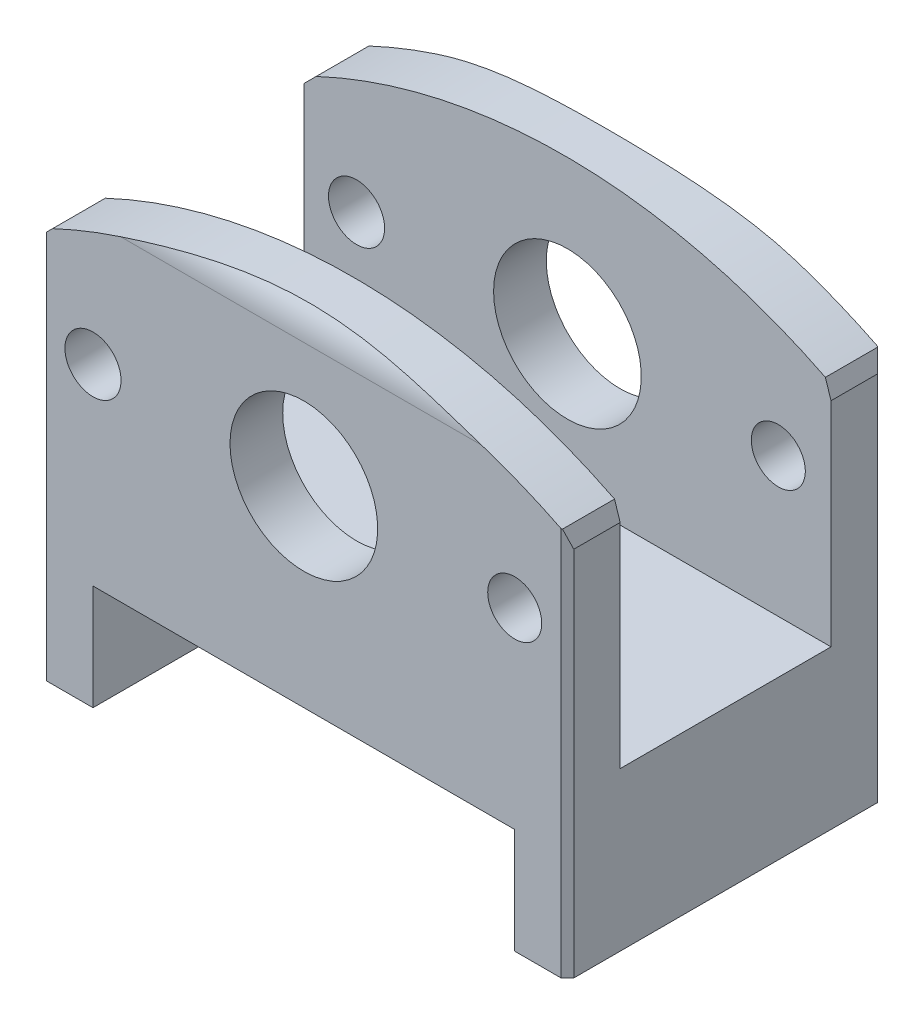
ISO-10303-21;
HEADER;
FILE_DESCRIPTION(('STEP AP214'),'2;1');
FILE_NAME('part.step','',(''),(''),'','','');
FILE_SCHEMA(('AUTOMOTIVE_DESIGN { 1 0 10303 214 1 1 1 1 }'));
ENDSEC;
DATA;
#1=APPLICATION_CONTEXT('core data for automotive mechanical design processes');
#2=APPLICATION_PROTOCOL_DEFINITION('international standard','automotive_design',2000,#1);
#3=PRODUCT_CONTEXT('',#1,'mechanical');
#4=PRODUCT('Part','Part','',(#3));
#5=PRODUCT_RELATED_PRODUCT_CATEGORY('part','',(#4));
#6=PRODUCT_DEFINITION_FORMATION('','',#4);
#7=PRODUCT_DEFINITION_CONTEXT('part definition',#1,'design');
#8=PRODUCT_DEFINITION('design','',#6,#7);
#9=PRODUCT_DEFINITION_SHAPE('','',#8);
#10=(LENGTH_UNIT() NAMED_UNIT(*) SI_UNIT(.MILLI.,.METRE.));
#11=(NAMED_UNIT(*) PLANE_ANGLE_UNIT() SI_UNIT($,.RADIAN.));
#12=(NAMED_UNIT(*) SI_UNIT($,.STERADIAN.) SOLID_ANGLE_UNIT());
#13=UNCERTAINTY_MEASURE_WITH_UNIT(LENGTH_MEASURE(1.E-05),#10,'distance_accuracy_value','');
#14=(GEOMETRIC_REPRESENTATION_CONTEXT(3) GLOBAL_UNCERTAINTY_ASSIGNED_CONTEXT((#13)) GLOBAL_UNIT_ASSIGNED_CONTEXT((#10,
#11,#12)) REPRESENTATION_CONTEXT('',''));
#15=CARTESIAN_POINT('',(0.,0.,0.));
#16=DIRECTION('',(0.,0.,1.));
#17=DIRECTION('',(1.,0.,0.));
#18=AXIS2_PLACEMENT_3D('',#15,#16,#17);
#19=CARTESIAN_POINT('',(0.,0.,38.1));
#20=DIRECTION('',(0.,1.,0.));
#21=DIRECTION('',(0.,0.,1.));
#22=AXIS2_PLACEMENT_3D('',#19,#20,#21);
#23=PLANE('',#22);
#24=DIRECTION('',(1.,0.,0.));
#25=VECTOR('',#24,1.);
#26=CARTESIAN_POINT('',(0.,0.,38.1));
#27=LINE('',#26,#25);
#28=CARTESIAN_POINT('',(0.761999999999999,0.,38.1));
#29=VERTEX_POINT('',#28);
#30=CARTESIAN_POINT('',(6.35,0.,38.1));
#31=VERTEX_POINT('',#30);
#32=EDGE_CURVE('E265',#29,#31,#27,.T.);
#33=ORIENTED_EDGE('',*,*,#32,.F.);
#34=DIRECTION('',(0.707106781186548,0.,0.707106781186548));
#35=VECTOR('',#34,1.);
#36=CARTESIAN_POINT('',(0.,0.,37.338));
#37=LINE('',#36,#35);
#38=CARTESIAN_POINT('',(0.,0.,37.338));
#39=VERTEX_POINT('',#38);
#40=EDGE_CURVE('E335',#29,#39,#37,.F.);
#41=ORIENTED_EDGE('',*,*,#40,.T.);
#42=DIRECTION('',(0.,0.,-1.));
#43=VECTOR('',#42,1.);
#44=CARTESIAN_POINT('',(0.,0.,38.1));
#45=LINE('',#44,#43);
#46=CARTESIAN_POINT('',(0.,0.,0.762000000000013));
#47=VERTEX_POINT('',#46);
#48=EDGE_CURVE('E268',#39,#47,#45,.T.);
#49=ORIENTED_EDGE('',*,*,#48,.T.);
#50=DIRECTION('',(0.707106781186541,0.,-0.707106781186554));
#51=VECTOR('',#50,1.);
#52=CARTESIAN_POINT('',(0.761999999999999,0.,0.));
#53=LINE('',#52,#51);
#54=CARTESIAN_POINT('',(0.761999999999999,0.,0.));
#55=VERTEX_POINT('',#54);
#56=EDGE_CURVE('E332',#47,#55,#53,.T.);
#57=ORIENTED_EDGE('',*,*,#56,.T.);
#58=DIRECTION('',(1.,0.,0.));
#59=VECTOR('',#58,1.);
#60=CARTESIAN_POINT('',(0.,0.,0.));
#61=LINE('',#60,#59);
#62=CARTESIAN_POINT('',(6.35,0.,0.));
#63=VERTEX_POINT('',#62);
#64=EDGE_CURVE('E270',#55,#63,#61,.T.);
#65=ORIENTED_EDGE('',*,*,#64,.T.);
#66=DIRECTION('',(0.,0.,-1.));
#67=VECTOR('',#66,1.);
#68=CARTESIAN_POINT('',(6.35,0.,38.1));
#69=LINE('',#68,#67);
#70=EDGE_CURVE('E239',#31,#63,#69,.T.);
#71=ORIENTED_EDGE('',*,*,#70,.F.);
#72=EDGE_LOOP('',(#33,#41,#49,#57,#65,#71));
#73=FACE_BOUND('',#72,.T.);
#74=ADVANCED_FACE('F40',(#73),#23,.F.);
#75=DIRECTION('',(0.,0.,-1.));
#76=VECTOR('',#75,1.);
#77=CARTESIAN_POINT('',(63.5,0.,38.1));
#78=LINE('',#77,#76);
#79=CARTESIAN_POINT('',(63.5,0.,37.338));
#80=VERTEX_POINT('',#79);
#81=CARTESIAN_POINT('',(63.5,0.,0.761999999999999));
#82=VERTEX_POINT('',#81);
#83=EDGE_CURVE('E276',#80,#82,#78,.T.);
#84=ORIENTED_EDGE('',*,*,#83,.F.);
#85=DIRECTION('',(-0.707106781186548,0.,0.707106781186548));
#86=VECTOR('',#85,1.);
#87=CARTESIAN_POINT('',(62.738,0.,38.1));
#88=LINE('',#87,#86);
#89=CARTESIAN_POINT('',(62.738,0.,38.1));
#90=VERTEX_POINT('',#89);
#91=EDGE_CURVE('E322',#80,#90,#88,.T.);
#92=ORIENTED_EDGE('',*,*,#91,.T.);
#93=CARTESIAN_POINT('',(57.15,0.,38.1));
#94=VERTEX_POINT('',#93);
#95=EDGE_CURVE('E269',#94,#90,#27,.T.);
#96=ORIENTED_EDGE('',*,*,#95,.F.);
#97=DIRECTION('',(0.,0.,-1.));
#98=VECTOR('',#97,1.);
#99=CARTESIAN_POINT('',(57.15,0.,38.1));
#100=LINE('',#99,#98);
#101=CARTESIAN_POINT('',(57.15,0.,0.));
#102=VERTEX_POINT('',#101);
#103=EDGE_CURVE('E251',#94,#102,#100,.T.);
#104=ORIENTED_EDGE('',*,*,#103,.T.);
#105=CARTESIAN_POINT('',(62.738,0.,0.));
#106=VERTEX_POINT('',#105);
#107=EDGE_CURVE('E255',#102,#106,#61,.T.);
#108=ORIENTED_EDGE('',*,*,#107,.T.);
#109=DIRECTION('',(-0.707106781186554,0.,-0.707106781186541));
#110=VECTOR('',#109,1.);
#111=CARTESIAN_POINT('',(63.5,0.,0.761999999999999));
#112=LINE('',#111,#110);
#113=EDGE_CURVE('E308',#106,#82,#112,.F.);
#114=ORIENTED_EDGE('',*,*,#113,.T.);
#115=EDGE_LOOP('',(#84,#92,#96,#104,#108,#114));
#116=FACE_BOUND('',#115,.T.);
#117=ADVANCED_FACE('F518',(#116),#23,.F.);
#118=CARTESIAN_POINT('',(63.5,0.,38.1));
#119=DIRECTION('',(-1.,0.,0.));
#120=DIRECTION('',(0.,0.,1.));
#121=AXIS2_PLACEMENT_3D('',#118,#119,#120);
#122=PLANE('',#121);
#123=DIRECTION('',(0.,1.,0.));
#124=VECTOR('',#123,1.);
#125=CARTESIAN_POINT('',(63.5,0.,0.761999999999999));
#126=LINE('',#125,#124);
#127=CARTESIAN_POINT('',(63.5,44.725116352659,0.761999999999999));
#128=VERTEX_POINT('',#127);
#129=EDGE_CURVE('E287',#82,#128,#126,.T.);
#130=ORIENTED_EDGE('',*,*,#129,.T.);
#131=DIRECTION('',(0.,0.,1.));
#132=VECTOR('',#131,1.);
#133=CARTESIAN_POINT('',(63.5,44.725116352659,38.1));
#134=LINE('',#133,#132);
#135=CARTESIAN_POINT('',(63.5,44.725116352659,6.35000000000001));
#136=VERTEX_POINT('',#135);
#137=EDGE_CURVE('E217',#128,#136,#134,.T.);
#138=ORIENTED_EDGE('',*,*,#137,.T.);
#139=DIRECTION('',(0.,1.,0.));
#140=VECTOR('',#139,1.);
#141=CARTESIAN_POINT('',(63.5,19.0499999999999,6.35000000000001));
#142=LINE('',#141,#140);
#143=CARTESIAN_POINT('',(63.5,19.0499999999999,6.35000000000001));
#144=VERTEX_POINT('',#143);
#145=EDGE_CURVE('E195',#144,#136,#142,.T.);
#146=ORIENTED_EDGE('',*,*,#145,.F.);
#147=DIRECTION('',(0.,0.,-1.));
#148=VECTOR('',#147,1.);
#149=CARTESIAN_POINT('',(63.5,19.0499999999999,31.75));
#150=LINE('',#149,#148);
#151=CARTESIAN_POINT('',(63.5,19.0499999999999,31.75));
#152=VERTEX_POINT('',#151);
#153=EDGE_CURVE('E202',#152,#144,#150,.T.);
#154=ORIENTED_EDGE('',*,*,#153,.F.);
#155=DIRECTION('',(0.,1.,0.));
#156=VECTOR('',#155,1.);
#157=CARTESIAN_POINT('',(63.5,19.0499999999999,31.75));
#158=LINE('',#157,#156);
#159=CARTESIAN_POINT('',(63.5,44.725116352659,31.75));
#160=VERTEX_POINT('',#159);
#161=EDGE_CURVE('E245',#152,#160,#158,.T.);
#162=ORIENTED_EDGE('',*,*,#161,.T.);
#163=DIRECTION('',(0.,0.,1.));
#164=VECTOR('',#163,1.);
#165=CARTESIAN_POINT('',(63.5,44.725116352659,38.1));
#166=LINE('',#165,#164);
#167=CARTESIAN_POINT('',(63.5,44.725116352659,37.338));
#168=VERTEX_POINT('',#167);
#169=EDGE_CURVE('E386',#160,#168,#166,.T.);
#170=ORIENTED_EDGE('',*,*,#169,.T.);
#171=DIRECTION('',(0.,-1.,0.));
#172=VECTOR('',#171,1.);
#173=CARTESIAN_POINT('',(63.5,0.,37.338));
#174=LINE('',#173,#172);
#175=EDGE_CURVE('E312',#168,#80,#174,.T.);
#176=ORIENTED_EDGE('',*,*,#175,.T.);
#177=ORIENTED_EDGE('',*,*,#83,.T.);
#178=EDGE_LOOP('',(#130,#138,#146,#154,#162,#170,#176,#177));
#179=FACE_BOUND('',#178,.T.);
#180=ADVANCED_FACE('F215',(#179),#122,.F.);
#181=CARTESIAN_POINT('',(0.,0.,38.1));
#182=DIRECTION('',(-1.,0.,0.));
#183=DIRECTION('',(0.,-1.,0.));
#184=AXIS2_PLACEMENT_3D('',#181,#182,#183);
#185=PLANE('',#184);
#186=DIRECTION('',(0.,1.,0.));
#187=VECTOR('',#186,1.);
#188=CARTESIAN_POINT('',(0.,19.0499999999999,6.35000000000002));
#189=LINE('',#188,#187);
#190=CARTESIAN_POINT('',(0.,19.0499999999999,6.35000000000001));
#191=VERTEX_POINT('',#190);
#192=CARTESIAN_POINT('',(0.,46.0638251112993,6.35000000000002));
#193=VERTEX_POINT('',#192);
#194=EDGE_CURVE('E197',#191,#193,#189,.T.);
#195=ORIENTED_EDGE('',*,*,#194,.T.);
#196=DIRECTION('',(0.,0.,-1.));
#197=VECTOR('',#196,1.);
#198=CARTESIAN_POINT('',(0.,46.0638251112993,0.762000000000013));
#199=LINE('',#198,#197);
#200=CARTESIAN_POINT('',(0.,46.0638251112993,0.762000000000013));
#201=VERTEX_POINT('',#200);
#202=EDGE_CURVE('E358',#193,#201,#199,.T.);
#203=ORIENTED_EDGE('',*,*,#202,.T.);
#204=DIRECTION('',(0.,-1.,0.));
#205=VECTOR('',#204,1.);
#206=CARTESIAN_POINT('',(0.,0.,0.762000000000013));
#207=LINE('',#206,#205);
#208=EDGE_CURVE('E325',#201,#47,#207,.T.);
#209=ORIENTED_EDGE('',*,*,#208,.T.);
#210=ORIENTED_EDGE('',*,*,#48,.F.);
#211=DIRECTION('',(0.,1.,0.));
#212=VECTOR('',#211,1.);
#213=CARTESIAN_POINT('',(0.,0.,37.338));
#214=LINE('',#213,#212);
#215=CARTESIAN_POINT('',(0.,46.0638251112993,37.338));
#216=VERTEX_POINT('',#215);
#217=EDGE_CURVE('E328',#39,#216,#214,.T.);
#218=ORIENTED_EDGE('',*,*,#217,.T.);
#219=DIRECTION('',(0.,0.,-1.));
#220=VECTOR('',#219,1.);
#221=CARTESIAN_POINT('',(0.,46.0638251112993,31.75));
#222=LINE('',#221,#220);
#223=CARTESIAN_POINT('',(0.,46.0638251112993,31.75));
#224=VERTEX_POINT('',#223);
#225=EDGE_CURVE('E355',#216,#224,#222,.T.);
#226=ORIENTED_EDGE('',*,*,#225,.T.);
#227=DIRECTION('',(0.,1.,0.));
#228=VECTOR('',#227,1.);
#229=CARTESIAN_POINT('',(0.,19.0499999999999,31.75));
#230=LINE('',#229,#228);
#231=CARTESIAN_POINT('',(0.,19.0499999999999,31.75));
#232=VERTEX_POINT('',#231);
#233=EDGE_CURVE('E222',#232,#224,#230,.T.);
#234=ORIENTED_EDGE('',*,*,#233,.F.);
#235=DIRECTION('',(0.,0.,1.));
#236=VECTOR('',#235,1.);
#237=CARTESIAN_POINT('',(0.,19.0499999999999,31.75));
#238=LINE('',#237,#236);
#239=EDGE_CURVE('E201',#191,#232,#238,.T.);
#240=ORIENTED_EDGE('',*,*,#239,.F.);
#241=EDGE_LOOP('',(#195,#203,#209,#210,#218,#226,#234,#240));
#242=FACE_BOUND('',#241,.T.);
#243=ADVANCED_FACE('F528',(#242),#185,.T.);
#244=CARTESIAN_POINT('',(0.,0.,38.1));
#245=DIRECTION('',(0.,0.,1.));
#246=DIRECTION('',(1.,0.,0.));
#247=AXIS2_PLACEMENT_3D('',#244,#245,#246);
#248=PLANE('',#247);
#249=CARTESIAN_POINT('',(31.4169464471682,-15.9327542649305,38.1));
#250=DIRECTION('',(0.,0.,1.));
#251=DIRECTION('',(1.,0.,0.));
#252=AXIS2_PLACEMENT_3D('',#249,#250,#251);
#253=CIRCLE('',#252,70.1830735247949);
#254=CARTESIAN_POINT('',(1.48248817745936,47.5463132887586,38.1));
#255=VERTEX_POINT('',#254);
#256=CARTESIAN_POINT('',(9.68210534806725,50.8,38.1));
#257=VERTEX_POINT('',#256);
#258=EDGE_CURVE('E456',#255,#257,#253,.F.);
#259=ORIENTED_EDGE('',*,*,#258,.F.);
#260=DIRECTION('',(0.70710678118655,0.707106781186545,0.));
#261=VECTOR('',#260,1.);
#262=CARTESIAN_POINT('',(-23.0319125556496,23.0319125556498,38.1));
#263=LINE('',#262,#261);
#264=CARTESIAN_POINT('',(0.76199999999999,46.8258251112993,38.1));
#265=VERTEX_POINT('',#264);
#266=EDGE_CURVE('E374',#255,#265,#263,.F.);
#267=ORIENTED_EDGE('',*,*,#266,.T.);
#268=DIRECTION('',(0.,-1.,0.));
#269=VECTOR('',#268,1.);
#270=CARTESIAN_POINT('',(0.761999999999999,0.,38.1));
#271=LINE('',#270,#269);
#272=EDGE_CURVE('E315',#265,#29,#271,.T.);
#273=ORIENTED_EDGE('',*,*,#272,.T.);
#274=ORIENTED_EDGE('',*,*,#32,.T.);
#275=DIRECTION('',(0.,-1.,0.));
#276=VECTOR('',#275,1.);
#277=CARTESIAN_POINT('',(6.35,12.7,38.1));
#278=LINE('',#277,#276);
#279=CARTESIAN_POINT('',(6.35,12.7,38.1));
#280=VERTEX_POINT('',#279);
#281=EDGE_CURVE('E227',#280,#31,#278,.T.);
#282=ORIENTED_EDGE('',*,*,#281,.F.);
#283=DIRECTION('',(-1.,0.,0.));
#284=VECTOR('',#283,1.);
#285=CARTESIAN_POINT('',(57.15,12.7,38.1));
#286=LINE('',#285,#284);
#287=CARTESIAN_POINT('',(57.15,12.7,38.1));
#288=VERTEX_POINT('',#287);
#289=EDGE_CURVE('E231',#288,#280,#286,.T.);
#290=ORIENTED_EDGE('',*,*,#289,.F.);
#291=DIRECTION('',(0.,-1.,0.));
#292=VECTOR('',#291,1.);
#293=CARTESIAN_POINT('',(57.15,12.7,38.1));
#294=LINE('',#293,#292);
#295=EDGE_CURVE('E235',#288,#94,#294,.T.);
#296=ORIENTED_EDGE('',*,*,#295,.T.);
#297=ORIENTED_EDGE('',*,*,#95,.T.);
#298=DIRECTION('',(0.,1.,0.));
#299=VECTOR('',#298,1.);
#300=CARTESIAN_POINT('',(62.738,50.8,38.1));
#301=LINE('',#300,#299);
#302=CARTESIAN_POINT('',(62.738,46.8737375470423,38.1));
#303=VERTEX_POINT('',#302);
#304=EDGE_CURVE('E318',#90,#303,#301,.T.);
#305=ORIENTED_EDGE('',*,*,#304,.T.);
#306=CARTESIAN_POINT('',(53.151787546269,50.8,38.1));
#307=VERTEX_POINT('',#306);
#308=EDGE_CURVE('E441',#307,#303,#253,.F.);
#309=ORIENTED_EDGE('',*,*,#308,.F.);
#310=DIRECTION('',(1.,0.,0.));
#311=VECTOR('',#310,1.);
#312=CARTESIAN_POINT('',(0.,50.8,38.1));
#313=LINE('',#312,#311);
#314=EDGE_CURVE('E279',#307,#257,#313,.F.);
#315=ORIENTED_EDGE('',*,*,#314,.T.);
#316=EDGE_LOOP('',(#259,#267,#273,#274,#282,#290,#296,#297,#305,#309,#315));
#317=FACE_BOUND('',#316,.T.);
#318=CARTESIAN_POINT('',(57.15,35.8193119319736,38.1));
#319=DIRECTION('',(0.,0.,-1.));
#320=DIRECTION('',(-1.,0.,0.));
#321=AXIS2_PLACEMENT_3D('',#318,#319,#320);
#322=CIRCLE('',#321,3.25273062765319);
#323=CARTESIAN_POINT('',(53.8972693723468,35.8193119319736,38.1));
#324=VERTEX_POINT('',#323);
#325=EDGE_CURVE('E293',#324,#324,#322,.T.);
#326=ORIENTED_EDGE('',*,*,#325,.T.);
#327=EDGE_LOOP('',(#326));
#328=FACE_BOUND('',#327,.T.);
#329=CARTESIAN_POINT('',(6.35,35.8193119319736,38.1));
#330=DIRECTION('',(0.,0.,-1.));
#331=DIRECTION('',(-1.,0.,0.));
#332=AXIS2_PLACEMENT_3D('',#329,#330,#331);
#333=CIRCLE('',#332,3.37949550170508);
#334=CARTESIAN_POINT('',(2.97050449829492,35.8193119319736,38.1));
#335=VERTEX_POINT('',#334);
#336=EDGE_CURVE('E427',#335,#335,#333,.T.);
#337=ORIENTED_EDGE('',*,*,#336,.T.);
#338=EDGE_LOOP('',(#337));
#339=FACE_BOUND('',#338,.T.);
#340=CARTESIAN_POINT('',(31.75,35.8193119319736,38.1));
#341=DIRECTION('',(0.,0.,-1.));
#342=DIRECTION('',(-1.,0.,0.));
#343=AXIS2_PLACEMENT_3D('',#340,#341,#342);
#344=CIRCLE('',#343,8.89550424363694);
#345=CARTESIAN_POINT('',(22.8544957563631,35.8193119319736,38.1));
#346=VERTEX_POINT('',#345);
#347=EDGE_CURVE('E418',#346,#346,#344,.T.);
#348=ORIENTED_EDGE('',*,*,#347,.T.);
#349=EDGE_LOOP('',(#348));
#350=FACE_BOUND('',#349,.T.);
#351=ADVANCED_FACE('F531',(#317,#328,#339,#350),#248,.T.);
#352=CARTESIAN_POINT('',(0.,0.,0.));
#353=DIRECTION('',(0.,0.,1.));
#354=DIRECTION('',(1.,0.,0.));
#355=AXIS2_PLACEMENT_3D('',#352,#353,#354);
#356=PLANE('',#355);
#357=CARTESIAN_POINT('',(57.15,35.8193119319736,0.));
#358=DIRECTION('',(0.,0.,-1.));
#359=DIRECTION('',(-1.,0.,0.));
#360=AXIS2_PLACEMENT_3D('',#357,#358,#359);
#361=CIRCLE('',#360,3.25273062765319);
#362=CARTESIAN_POINT('',(53.8972693723468,35.8193119319736,0.));
#363=VERTEX_POINT('',#362);
#364=EDGE_CURVE('E431',#363,#363,#361,.T.);
#365=ORIENTED_EDGE('',*,*,#364,.F.);
#366=EDGE_LOOP('',(#365));
#367=FACE_BOUND('',#366,.T.);
#368=CARTESIAN_POINT('',(6.35,35.8193119319736,0.));
#369=DIRECTION('',(0.,0.,-1.));
#370=DIRECTION('',(-1.,0.,0.));
#371=AXIS2_PLACEMENT_3D('',#368,#369,#370);
#372=CIRCLE('',#371,3.37949550170508);
#373=CARTESIAN_POINT('',(2.97050449829492,35.8193119319736,0.));
#374=VERTEX_POINT('',#373);
#375=EDGE_CURVE('E423',#374,#374,#372,.T.);
#376=ORIENTED_EDGE('',*,*,#375,.F.);
#377=EDGE_LOOP('',(#376));
#378=FACE_BOUND('',#377,.T.);
#379=CARTESIAN_POINT('',(31.75,35.8193119319736,0.));
#380=DIRECTION('',(0.,0.,-1.));
#381=DIRECTION('',(-1.,0.,0.));
#382=AXIS2_PLACEMENT_3D('',#379,#380,#381);
#383=CIRCLE('',#382,8.89550424363694);
#384=CARTESIAN_POINT('',(22.8544957563631,35.8193119319736,0.));
#385=VERTEX_POINT('',#384);
#386=EDGE_CURVE('E414',#385,#385,#383,.T.);
#387=ORIENTED_EDGE('',*,*,#386,.F.);
#388=EDGE_LOOP('',(#387));
#389=FACE_BOUND('',#388,.T.);
#390=DIRECTION('',(0.,1.,0.));
#391=VECTOR('',#390,1.);
#392=CARTESIAN_POINT('',(0.761999999999989,50.8,0.));
#393=LINE('',#392,#391);
#394=CARTESIAN_POINT('',(0.76199999999999,46.8258251112993,0.));
#395=VERTEX_POINT('',#394);
#396=EDGE_CURVE('E338',#55,#395,#393,.T.);
#397=ORIENTED_EDGE('',*,*,#396,.T.);
#398=DIRECTION('',(-0.70710678118655,-0.707106781186545,0.));
#399=VECTOR('',#398,1.);
#400=CARTESIAN_POINT('',(1.48248817745933,47.5463132887586,0.));
#401=LINE('',#400,#399);
#402=CARTESIAN_POINT('',(1.48248817745931,47.5463132887586,0.));
#403=VERTEX_POINT('',#402);
#404=EDGE_CURVE('E364',#395,#403,#401,.F.);
#405=ORIENTED_EDGE('',*,*,#404,.T.);
#406=CARTESIAN_POINT('',(31.4169464471682,-15.9327542649305,0.));
#407=DIRECTION('',(0.,0.,1.));
#408=DIRECTION('',(1.,0.,0.));
#409=AXIS2_PLACEMENT_3D('',#406,#407,#408);
#410=CIRCLE('',#409,70.1830735247949);
#411=CARTESIAN_POINT('',(9.68210534806725,50.8,0.));
#412=VERTEX_POINT('',#411);
#413=EDGE_CURVE('E483',#403,#412,#410,.F.);
#414=ORIENTED_EDGE('',*,*,#413,.T.);
#415=DIRECTION('',(1.,0.,0.));
#416=VECTOR('',#415,1.);
#417=CARTESIAN_POINT('',(63.5,50.8,0.));
#418=LINE('',#417,#416);
#419=CARTESIAN_POINT('',(53.151787546269,50.8,0.));
#420=VERTEX_POINT('',#419);
#421=EDGE_CURVE('E283',#412,#420,#418,.T.);
#422=ORIENTED_EDGE('',*,*,#421,.T.);
#423=CARTESIAN_POINT('',(62.738,46.8737375470423,0.));
#424=VERTEX_POINT('',#423);
#425=EDGE_CURVE('E605',#420,#424,#410,.F.);
#426=ORIENTED_EDGE('',*,*,#425,.T.);
#427=DIRECTION('',(0.,-1.,0.));
#428=VECTOR('',#427,1.);
#429=CARTESIAN_POINT('',(62.738,0.,0.));
#430=LINE('',#429,#428);
#431=EDGE_CURVE('E305',#424,#106,#430,.T.);
#432=ORIENTED_EDGE('',*,*,#431,.T.);
#433=ORIENTED_EDGE('',*,*,#107,.F.);
#434=DIRECTION('',(0.,-1.,0.));
#435=VECTOR('',#434,1.);
#436=CARTESIAN_POINT('',(57.15,12.7,0.));
#437=LINE('',#436,#435);
#438=CARTESIAN_POINT('',(57.15,12.7,0.));
#439=VERTEX_POINT('',#438);
#440=EDGE_CURVE('E232',#439,#102,#437,.T.);
#441=ORIENTED_EDGE('',*,*,#440,.F.);
#442=DIRECTION('',(-1.,0.,0.));
#443=VECTOR('',#442,1.);
#444=CARTESIAN_POINT('',(57.15,12.7,0.));
#445=LINE('',#444,#443);
#446=CARTESIAN_POINT('',(6.35,12.7,0.));
#447=VERTEX_POINT('',#446);
#448=EDGE_CURVE('E244',#439,#447,#445,.T.);
#449=ORIENTED_EDGE('',*,*,#448,.T.);
#450=DIRECTION('',(0.,-1.,0.));
#451=VECTOR('',#450,1.);
#452=CARTESIAN_POINT('',(6.35,12.7,0.));
#453=LINE('',#452,#451);
#454=EDGE_CURVE('E240',#447,#63,#453,.T.);
#455=ORIENTED_EDGE('',*,*,#454,.T.);
#456=ORIENTED_EDGE('',*,*,#64,.F.);
#457=EDGE_LOOP('',(#397,#405,#414,#422,#426,#432,#433,#441,#449,#455,#456));
#458=FACE_BOUND('',#457,.T.);
#459=ADVANCED_FACE('F533',(#367,#378,#389,#458),#356,.F.);
#460=CARTESIAN_POINT('',(57.15,12.7,38.1));
#461=DIRECTION('',(1.,0.,0.));
#462=DIRECTION('',(0.,0.,-1.));
#463=AXIS2_PLACEMENT_3D('',#460,#461,#462);
#464=PLANE('',#463);
#465=ORIENTED_EDGE('',*,*,#440,.T.);
#466=ORIENTED_EDGE('',*,*,#103,.F.);
#467=ORIENTED_EDGE('',*,*,#295,.F.);
#468=DIRECTION('',(0.,0.,-1.));
#469=VECTOR('',#468,1.);
#470=CARTESIAN_POINT('',(57.15,12.7,38.1));
#471=LINE('',#470,#469);
#472=EDGE_CURVE('E256',#288,#439,#471,.T.);
#473=ORIENTED_EDGE('',*,*,#472,.T.);
#474=EDGE_LOOP('',(#465,#466,#467,#473));
#475=FACE_BOUND('',#474,.T.);
#476=ADVANCED_FACE('F536',(#475),#464,.F.);
#477=CARTESIAN_POINT('',(57.15,12.7,38.1));
#478=DIRECTION('',(0.,-1.,0.));
#479=DIRECTION('',(0.,0.,-1.));
#480=AXIS2_PLACEMENT_3D('',#477,#478,#479);
#481=PLANE('',#480);
#482=ORIENTED_EDGE('',*,*,#448,.F.);
#483=ORIENTED_EDGE('',*,*,#472,.F.);
#484=ORIENTED_EDGE('',*,*,#289,.T.);
#485=DIRECTION('',(0.,0.,-1.));
#486=VECTOR('',#485,1.);
#487=CARTESIAN_POINT('',(6.35,12.7,38.1));
#488=LINE('',#487,#486);
#489=EDGE_CURVE('E259',#280,#447,#488,.T.);
#490=ORIENTED_EDGE('',*,*,#489,.T.);
#491=EDGE_LOOP('',(#482,#483,#484,#490));
#492=FACE_BOUND('',#491,.T.);
#493=ADVANCED_FACE('F545',(#492),#481,.T.);
#494=CARTESIAN_POINT('',(6.35,12.7,38.1));
#495=DIRECTION('',(1.,0.,0.));
#496=DIRECTION('',(0.,1.,0.));
#497=AXIS2_PLACEMENT_3D('',#494,#495,#496);
#498=PLANE('',#497);
#499=ORIENTED_EDGE('',*,*,#454,.F.);
#500=ORIENTED_EDGE('',*,*,#489,.F.);
#501=ORIENTED_EDGE('',*,*,#281,.T.);
#502=ORIENTED_EDGE('',*,*,#70,.T.);
#503=EDGE_LOOP('',(#499,#500,#501,#502));
#504=FACE_BOUND('',#503,.T.);
#505=ADVANCED_FACE('F541',(#504),#498,.T.);
#506=CARTESIAN_POINT('',(63.5,19.0499999999999,31.75));
#507=DIRECTION('',(0.,0.,1.));
#508=DIRECTION('',(1.,0.,0.));
#509=AXIS2_PLACEMENT_3D('',#506,#507,#508);
#510=PLANE('',#509);
#511=CARTESIAN_POINT('',(57.15,35.8193119319736,31.75));
#512=DIRECTION('',(0.,0.,1.));
#513=DIRECTION('',(1.,0.,0.));
#514=AXIS2_PLACEMENT_3D('',#511,#512,#513);
#515=CIRCLE('',#514,3.25273062765319);
#516=CARTESIAN_POINT('',(60.4027306276532,35.8193119319736,31.75));
#517=VERTEX_POINT('',#516);
#518=EDGE_CURVE('E212',#517,#517,#515,.T.);
#519=ORIENTED_EDGE('',*,*,#518,.T.);
#520=EDGE_LOOP('',(#519));
#521=FACE_BOUND('',#520,.T.);
#522=CARTESIAN_POINT('',(6.35,35.8193119319736,31.75));
#523=DIRECTION('',(0.,0.,1.));
#524=DIRECTION('',(1.,0.,0.));
#525=AXIS2_PLACEMENT_3D('',#522,#523,#524);
#526=CIRCLE('',#525,3.37949550170508);
#527=CARTESIAN_POINT('',(9.72949550170508,35.8193119319736,31.75));
#528=VERTEX_POINT('',#527);
#529=EDGE_CURVE('E298',#528,#528,#526,.T.);
#530=ORIENTED_EDGE('',*,*,#529,.T.);
#531=EDGE_LOOP('',(#530));
#532=FACE_BOUND('',#531,.T.);
#533=CARTESIAN_POINT('',(31.75,35.8193119319736,31.75));
#534=DIRECTION('',(0.,0.,1.));
#535=DIRECTION('',(1.,0.,0.));
#536=AXIS2_PLACEMENT_3D('',#533,#534,#535);
#537=CIRCLE('',#536,8.89550424363694);
#538=CARTESIAN_POINT('',(40.6455042436369,35.8193119319736,31.75));
#539=VERTEX_POINT('',#538);
#540=EDGE_CURVE('E292',#539,#539,#537,.T.);
#541=ORIENTED_EDGE('',*,*,#540,.T.);
#542=EDGE_LOOP('',(#541));
#543=FACE_BOUND('',#542,.T.);
#544=ORIENTED_EDGE('',*,*,#233,.T.);
#545=DIRECTION('',(-0.70710678118655,-0.707106781186545,0.));
#546=VECTOR('',#545,1.);
#547=CARTESIAN_POINT('',(1.48248817745933,47.5463132887586,31.75));
#548=LINE('',#547,#546);
#549=CARTESIAN_POINT('',(1.48248817745936,47.5463132887586,31.75));
#550=VERTEX_POINT('',#549);
#551=EDGE_CURVE('E383',#224,#550,#548,.F.);
#552=ORIENTED_EDGE('',*,*,#551,.T.);
#553=CARTESIAN_POINT('',(31.4169464471682,-15.9327542649305,31.75));
#554=DIRECTION('',(0.,0.,1.));
#555=DIRECTION('',(1.,0.,0.));
#556=AXIS2_PLACEMENT_3D('',#553,#554,#555);
#557=CIRCLE('',#556,70.1830735247949);
#558=CARTESIAN_POINT('',(62.8240477809651,46.8307526096489,31.75));
#559=VERTEX_POINT('',#558);
#560=EDGE_CURVE('E442',#550,#559,#557,.F.);
#561=ORIENTED_EDGE('',*,*,#560,.T.);
#562=DIRECTION('',(-0.305656925503066,0.952141714185453,0.));
#563=VECTOR('',#562,1.);
#564=CARTESIAN_POINT('',(63.5,44.725116352659,31.75));
#565=LINE('',#564,#563);
#566=EDGE_CURVE('E380',#559,#160,#565,.F.);
#567=ORIENTED_EDGE('',*,*,#566,.T.);
#568=ORIENTED_EDGE('',*,*,#161,.F.);
#569=DIRECTION('',(1.,0.,0.));
#570=VECTOR('',#569,1.);
#571=CARTESIAN_POINT('',(63.5,19.0499999999999,31.75));
#572=LINE('',#571,#570);
#573=EDGE_CURVE('E208',#232,#152,#572,.T.);
#574=ORIENTED_EDGE('',*,*,#573,.F.);
#575=EDGE_LOOP('',(#544,#552,#561,#567,#568,#574));
#576=FACE_BOUND('',#575,.T.);
#577=ADVANCED_FACE('F544',(#521,#532,#543,#576),#510,.F.);
#578=CARTESIAN_POINT('',(63.5,19.0499999999999,6.35000000000001));
#579=DIRECTION('',(0.,0.,-1.));
#580=DIRECTION('',(-1.,0.,0.));
#581=AXIS2_PLACEMENT_3D('',#578,#579,#580);
#582=PLANE('',#581);
#583=CARTESIAN_POINT('',(57.15,35.8193119319736,6.35000000000001));
#584=DIRECTION('',(0.,0.,-1.));
#585=DIRECTION('',(-1.,0.,0.));
#586=AXIS2_PLACEMENT_3D('',#583,#584,#585);
#587=CIRCLE('',#586,3.25273062765319);
#588=CARTESIAN_POINT('',(53.8972693723468,35.8193119319736,6.35000000000001));
#589=VERTEX_POINT('',#588);
#590=EDGE_CURVE('E299',#589,#589,#587,.T.);
#591=ORIENTED_EDGE('',*,*,#590,.T.);
#592=EDGE_LOOP('',(#591));
#593=FACE_BOUND('',#592,.T.);
#594=CARTESIAN_POINT('',(6.35,35.8193119319736,6.35000000000002));
#595=DIRECTION('',(0.,0.,-1.));
#596=DIRECTION('',(-1.,0.,0.));
#597=AXIS2_PLACEMENT_3D('',#594,#595,#596);
#598=CIRCLE('',#597,3.37949550170508);
#599=CARTESIAN_POINT('',(2.97050449829492,35.8193119319736,6.35000000000002));
#600=VERTEX_POINT('',#599);
#601=EDGE_CURVE('E294',#600,#600,#598,.T.);
#602=ORIENTED_EDGE('',*,*,#601,.T.);
#603=EDGE_LOOP('',(#602));
#604=FACE_BOUND('',#603,.T.);
#605=CARTESIAN_POINT('',(31.75,35.8193119319736,6.35000000000002));
#606=DIRECTION('',(0.,0.,-1.));
#607=DIRECTION('',(-1.,0.,0.));
#608=AXIS2_PLACEMENT_3D('',#605,#606,#607);
#609=CIRCLE('',#608,8.89550424363694);
#610=CARTESIAN_POINT('',(22.8544957563631,35.8193119319736,6.35000000000002));
#611=VERTEX_POINT('',#610);
#612=EDGE_CURVE('E288',#611,#611,#609,.T.);
#613=ORIENTED_EDGE('',*,*,#612,.T.);
#614=EDGE_LOOP('',(#613));
#615=FACE_BOUND('',#614,.T.);
#616=CARTESIAN_POINT('',(31.4169464471682,-15.9327542649305,6.35000000000001));
#617=DIRECTION('',(0.,0.,-1.));
#618=DIRECTION('',(-1.,0.,0.));
#619=AXIS2_PLACEMENT_3D('',#616,#617,#618);
#620=CIRCLE('',#619,70.1830735247949);
#621=CARTESIAN_POINT('',(62.8240477809651,46.8307526096489,6.35));
#622=VERTEX_POINT('',#621);
#623=CARTESIAN_POINT('',(1.48248817745931,47.5463132887586,6.35000000000001));
#624=VERTEX_POINT('',#623);
#625=EDGE_CURVE('E482',#622,#624,#620,.F.);
#626=ORIENTED_EDGE('',*,*,#625,.T.);
#627=DIRECTION('',(0.70710678118655,0.707106781186545,0.));
#628=VECTOR('',#627,1.);
#629=CARTESIAN_POINT('',(1.48248817745933,47.5463132887586,6.35000000000002));
#630=LINE('',#629,#628);
#631=EDGE_CURVE('E352',#624,#193,#630,.F.);
#632=ORIENTED_EDGE('',*,*,#631,.T.);
#633=ORIENTED_EDGE('',*,*,#194,.F.);
#634=DIRECTION('',(-1.,0.,0.));
#635=VECTOR('',#634,1.);
#636=CARTESIAN_POINT('',(63.5,19.0499999999999,6.35000000000001));
#637=LINE('',#636,#635);
#638=EDGE_CURVE('E190',#144,#191,#637,.T.);
#639=ORIENTED_EDGE('',*,*,#638,.F.);
#640=ORIENTED_EDGE('',*,*,#145,.T.);
#641=DIRECTION('',(0.305656925503066,-0.952141714185453,0.));
#642=VECTOR('',#641,1.);
#643=CARTESIAN_POINT('',(63.5,44.725116352659,6.35000000000001));
#644=LINE('',#643,#642);
#645=EDGE_CURVE('E349',#136,#622,#644,.F.);
#646=ORIENTED_EDGE('',*,*,#645,.T.);
#647=EDGE_LOOP('',(#626,#632,#633,#639,#640,#646));
#648=FACE_BOUND('',#647,.T.);
#649=ADVANCED_FACE('F193',(#593,#604,#615,#648),#582,.F.);
#650=CARTESIAN_POINT('',(0.,19.0499999999999,0.));
#651=DIRECTION('',(0.,1.,0.));
#652=DIRECTION('',(-1.,0.,0.));
#653=AXIS2_PLACEMENT_3D('',#650,#651,#652);
#654=PLANE('',#653);
#655=ORIENTED_EDGE('',*,*,#153,.T.);
#656=ORIENTED_EDGE('',*,*,#638,.T.);
#657=ORIENTED_EDGE('',*,*,#239,.T.);
#658=ORIENTED_EDGE('',*,*,#573,.T.);
#659=EDGE_LOOP('',(#655,#656,#657,#658));
#660=FACE_BOUND('',#659,.T.);
#661=ADVANCED_FACE('F206',(#660),#654,.T.);
#662=CARTESIAN_POINT('',(0.,50.8,31.75));
#663=DIRECTION('',(1.,0.,0.));
#664=DIRECTION('',(0.,1.,0.));
#665=AXIS2_PLACEMENT_3D('',#662,#663,#664);
#666=CYLINDRICAL_SURFACE('',#665,6.35);
#667=CARTESIAN_POINT('',(9.68210534806725,50.8,38.1));
#668=CARTESIAN_POINT('',(9.9355496216742,50.8825469032516,38.0999970636096));
#669=CARTESIAN_POINT('',(10.1894575550833,50.9636474636782,38.0983907218938));
#670=CARTESIAN_POINT('',(10.6981419647237,51.1229388377297,38.0922843496237));
#671=CARTESIAN_POINT('',(10.9529184143378,51.2011297396661,38.0877844069694));
#672=CARTESIAN_POINT('',(11.7183910335145,51.4312913492091,38.0704158149861));
#673=CARTESIAN_POINT('',(12.2303243463047,51.5788815332646,38.0536781685595));
#674=CARTESIAN_POINT('',(13.2566226540831,51.8621540142009,38.0121719076857));
#675=CARTESIAN_POINT('',(13.7709849639527,51.9978471919829,37.9874107309305));
#676=CARTESIAN_POINT('',(14.8023685803859,52.2574387255733,37.9319071527611));
#677=CARTESIAN_POINT('',(15.3193900162459,52.3813365020208,37.9011644577752));
#678=CARTESIAN_POINT('',(16.8749559551457,52.7354778455332,37.8028163630243));
#679=CARTESIAN_POINT('',(17.9172072852947,52.9479501147091,37.7291291519275));
#680=CARTESIAN_POINT('',(20.0106388516807,53.3253992949422,37.5797575570231));
#681=CARTESIAN_POINT('',(21.0618233575857,53.4903520068459,37.5040721769957));
#682=CARTESIAN_POINT('',(22.9783742782697,53.7465843564425,37.376428103599));
#683=CARTESIAN_POINT('',(23.8425582727482,53.8458209948674,37.3226617352109));
#684=CARTESIAN_POINT('',(25.5748084630671,54.0121547697245,37.2284802582864));
#685=CARTESIAN_POINT('',(26.442874807233,54.0792506674469,37.1880656643484));
#686=CARTESIAN_POINT('',(28.1813771596615,54.1811022039774,37.1253380371723));
#687=CARTESIAN_POINT('',(29.051812568552,54.2158653757497,37.1030207877222));
#688=CARTESIAN_POINT('',(30.7936451129573,54.2529572201974,37.0791735628923));
#689=CARTESIAN_POINT('',(31.6650422186797,54.2552868709055,37.0776429606914));
#690=CARTESIAN_POINT('',(33.4068650483817,54.2275089326214,37.0955534646619));
#691=CARTESIAN_POINT('',(34.2772909674358,54.1974098665422,37.1149890605002));
#692=CARTESIAN_POINT('',(36.0158204220473,54.1048928050068,37.1724637850892));
#693=CARTESIAN_POINT('',(36.8839238543571,54.0424733959603,37.2105037275314));
#694=CARTESIAN_POINT('',(38.6166312559026,53.8854760967558,37.3007203280242));
#695=CARTESIAN_POINT('',(39.4812344658875,53.7908915719161,37.3528999021977));
#696=CARTESIAN_POINT('',(41.2057293121981,53.5697579920486,37.4654443499575));
#697=CARTESIAN_POINT('',(42.0656212607774,53.4432110822649,37.5258086740756));
#698=CARTESIAN_POINT('',(43.7891882464269,53.1567732852784,37.6485289441833));
#699=CARTESIAN_POINT('',(44.6528052252998,52.9965399210729,37.7108992936348));
#700=CARTESIAN_POINT('',(46.3734495989395,52.6437549416677,37.8292841519455));
#701=CARTESIAN_POINT('',(47.2304800924607,52.451219638399,37.8853018449786));
#702=CARTESIAN_POINT('',(48.5100268591987,52.1384056633858,37.958267472961));
#703=CARTESIAN_POINT('',(48.9352144829331,52.0302258820658,37.9807326885104));
#704=CARTESIAN_POINT('',(49.7836925061019,51.8058536442595,38.0208651434512));
#705=CARTESIAN_POINT('',(50.2069829665997,51.6896614476674,38.0385325383752));
#706=CARTESIAN_POINT('',(51.0518562527967,51.4491956465608,38.0678911772716));
#707=CARTESIAN_POINT('',(51.4734373810711,51.32491545225,38.0795774775869));
#708=CARTESIAN_POINT('',(52.314360236413,51.0684041279616,38.0956205101397));
#709=CARTESIAN_POINT('',(52.7337017150575,50.936172135122,38.0999764454561));
#710=CARTESIAN_POINT('',(53.151787546269,50.8,38.1));
#711=B_SPLINE_CURVE_WITH_KNOTS('',3,(#667,#668,#669,#670,#671,#672,#673,#674,#675,#676,#677,
#678,#679,#680,#681,#682,#683,#684,#685,#686,#687,#688,#689,#690,#691,#692,#693,#694,#695,#696,
#697,#698,#699,#700,#701,#702,#703,#704,#705,#706,#707,#708,#709,#710),.UNSPECIFIED.,.F.,.F.,(4,
2,2,2,2,2,2,2,2,2,2,2,2,2,2,2,2,2,2,2,2,4),(0.,0.799623753206589,1.59922321706847,
3.19812609266505,4.79555102923093,6.39305438689959,9.59053461107278,12.7896402730545,
15.4035668220469,18.0175941041374,20.6310122105548,23.2443515091999,25.8570041376985,
28.469771045073,31.083077213752,33.6962080297371,36.3373151086308,38.9770924656936,
40.2949342493367,41.6127333069613,42.9316198357743,44.2506497381621),.UNSPECIFIED.);
#712=EDGE_CURVE('E446',#257,#307,#711,.T.);
#713=ORIENTED_EDGE('',*,*,#712,.F.);
#714=ORIENTED_EDGE('',*,*,#314,.F.);
#715=EDGE_LOOP('',(#713,#714));
#716=FACE_BOUND('',#715,.T.);
#717=ADVANCED_FACE('F458',(#716),#666,.T.);
#718=CARTESIAN_POINT('',(0.,50.8,6.35));
#719=DIRECTION('',(-1.,0.,0.));
#720=DIRECTION('',(0.,-1.,0.));
#721=AXIS2_PLACEMENT_3D('',#718,#719,#720);
#722=CYLINDRICAL_SURFACE('',#721,6.35);
#723=CARTESIAN_POINT('',(53.151787546269,50.8,0.));
#724=CARTESIAN_POINT('',(52.8983432726621,50.8825469032516,2.93639044751001E-06));
#725=CARTESIAN_POINT('',(52.644435339253,50.9636474636783,0.00160927810618691));
#726=CARTESIAN_POINT('',(52.1357509296126,51.1229388377297,0.0077156503763156));
#727=CARTESIAN_POINT('',(51.8809744799985,51.2011297396661,0.0122155930306262));
#728=CARTESIAN_POINT('',(51.1155018608218,51.4312913492091,0.0295841850138925));
#729=CARTESIAN_POINT('',(50.6035685480316,51.5788815332646,0.0463218314405313));
#730=CARTESIAN_POINT('',(49.5772702402532,51.8621540142009,0.0878280923142609));
#731=CARTESIAN_POINT('',(49.0629079303836,51.9978471919829,0.112589269069534));
#732=CARTESIAN_POINT('',(48.0315243139504,52.2574387255733,0.168092847238925));
#733=CARTESIAN_POINT('',(47.5145028780903,52.3813365020208,0.198835542224838));
#734=CARTESIAN_POINT('',(45.9589369391905,52.7354778455332,0.29718363697573));
#735=CARTESIAN_POINT('',(44.9166856090416,52.9479501147091,0.370870848072537));
#736=CARTESIAN_POINT('',(42.8232540426556,53.3253992949422,0.520242442976948));
#737=CARTESIAN_POINT('',(41.7720695367506,53.490352006846,0.59592782300431));
#738=CARTESIAN_POINT('',(39.8555186160666,53.7465843564425,0.723571896401016));
#739=CARTESIAN_POINT('',(38.9913346215881,53.8458209948673,0.777338264789106));
#740=CARTESIAN_POINT('',(37.2590844312691,54.0121547697245,0.871519741713591));
#741=CARTESIAN_POINT('',(36.3910180871033,54.0792506674469,0.911934335651561));
#742=CARTESIAN_POINT('',(34.6525157346748,54.1811022039774,0.974661962827677));
#743=CARTESIAN_POINT('',(33.7820803257843,54.2158653757497,0.996979212277767));
#744=CARTESIAN_POINT('',(32.0402477813789,54.2529572201974,1.02082643710766));
#745=CARTESIAN_POINT('',(31.1688506756566,54.2552868709055,1.02235703930861));
#746=CARTESIAN_POINT('',(29.4270278459546,54.2275089326214,1.00444653533815));
#747=CARTESIAN_POINT('',(28.5566019269005,54.1974098665422,0.985010939499782));
#748=CARTESIAN_POINT('',(26.818072472289,54.1048928050068,0.927536214910829));
#749=CARTESIAN_POINT('',(25.9499690399792,54.0424733959603,0.889496272468574));
#750=CARTESIAN_POINT('',(24.2172616384337,53.8854760967558,0.799279671975847));
#751=CARTESIAN_POINT('',(23.3526584284488,53.7908915719161,0.747100097802314));
#752=CARTESIAN_POINT('',(21.6281635821382,53.5697579920486,0.634555650042555));
#753=CARTESIAN_POINT('',(20.7682716335589,53.4432110822649,0.574191325924382));
#754=CARTESIAN_POINT('',(19.0447046479094,53.1567732852783,0.451471055816653));
#755=CARTESIAN_POINT('',(18.1810876690365,52.9965399210728,0.389100706365184));
#756=CARTESIAN_POINT('',(16.4604432953968,52.6437549416676,0.270715848054543));
#757=CARTESIAN_POINT('',(15.6034128018756,52.451219638399,0.214698155021375));
#758=CARTESIAN_POINT('',(14.3238660351376,52.1384056633858,0.141732527039031));
#759=CARTESIAN_POINT('',(13.8986784114032,52.0302258820658,0.119267311489654));
#760=CARTESIAN_POINT('',(13.0502003882343,51.8058536442595,0.0791348565488175));
#761=CARTESIAN_POINT('',(12.6269099277366,51.6896614476674,0.061467461624804));
#762=CARTESIAN_POINT('',(11.7820366415396,51.4491956465608,0.0321088227283779));
#763=CARTESIAN_POINT('',(11.3604555132651,51.32491545225,0.0204225224130952));
#764=CARTESIAN_POINT('',(10.5195326579233,51.0684041279616,0.00437948986030391));
#765=CARTESIAN_POINT('',(10.1001911792788,50.9361721351219,2.35545439063058E-05));
#766=CARTESIAN_POINT('',(9.68210534806725,50.8,0.));
#767=B_SPLINE_CURVE_WITH_KNOTS('',3,(#723,#724,#725,#726,#727,#728,#729,#730,#731,#732,#733,
#734,#735,#736,#737,#738,#739,#740,#741,#742,#743,#744,#745,#746,#747,#748,#749,#750,#751,#752,
#753,#754,#755,#756,#757,#758,#759,#760,#761,#762,#763,#764,#765,#766),.UNSPECIFIED.,.F.,.F.,(4,
2,2,2,2,2,2,2,2,2,2,2,2,2,2,2,2,2,2,2,2,4),(0.,0.799623753206583,1.59922321706846,
3.19812609266505,4.79555102923093,6.39305438689959,9.59053461107279,12.7896402730545,
15.4035668220469,18.0175941041373,20.6310122105548,23.2443515091999,25.8570041376985,
28.469771045073,31.083077213752,33.6962080297371,36.3373151086308,38.9770924656936,
40.2949342493366,41.6127333069613,42.9316198357743,44.2506497381621),.UNSPECIFIED.);
#768=EDGE_CURVE('E473',#420,#412,#767,.T.);
#769=ORIENTED_EDGE('',*,*,#768,.F.);
#770=ORIENTED_EDGE('',*,*,#421,.F.);
#771=EDGE_LOOP('',(#769,#770));
#772=FACE_BOUND('',#771,.T.);
#773=ADVANCED_FACE('F484',(#772),#722,.T.);
#774=CARTESIAN_POINT('',(31.75,35.8193119319736,38.1));
#775=DIRECTION('',(0.,0.,-1.));
#776=DIRECTION('',(-1.,0.,0.));
#777=AXIS2_PLACEMENT_3D('',#774,#775,#776);
#778=CYLINDRICAL_SURFACE('',#777,8.89550424363694);
#779=ORIENTED_EDGE('',*,*,#386,.T.);
#780=EDGE_LOOP('',(#779));
#781=FACE_BOUND('',#780,.T.);
#782=ORIENTED_EDGE('',*,*,#612,.F.);
#783=EDGE_LOOP('',(#782));
#784=FACE_BOUND('',#783,.T.);
#785=ADVANCED_FACE('F488',(#781,#784),#778,.F.);
#786=CARTESIAN_POINT('',(6.35,35.8193119319736,38.1));
#787=DIRECTION('',(0.,0.,-1.));
#788=DIRECTION('',(-1.,0.,0.));
#789=AXIS2_PLACEMENT_3D('',#786,#787,#788);
#790=CYLINDRICAL_SURFACE('',#789,3.37949550170508);
#791=ORIENTED_EDGE('',*,*,#375,.T.);
#792=EDGE_LOOP('',(#791));
#793=FACE_BOUND('',#792,.T.);
#794=ORIENTED_EDGE('',*,*,#601,.F.);
#795=EDGE_LOOP('',(#794));
#796=FACE_BOUND('',#795,.T.);
#797=ADVANCED_FACE('F568',(#793,#796),#790,.F.);
#798=CARTESIAN_POINT('',(57.15,35.8193119319736,38.1));
#799=DIRECTION('',(0.,0.,-1.));
#800=DIRECTION('',(-1.,0.,0.));
#801=AXIS2_PLACEMENT_3D('',#798,#799,#800);
#802=CYLINDRICAL_SURFACE('',#801,3.25273062765319);
#803=ORIENTED_EDGE('',*,*,#364,.T.);
#804=EDGE_LOOP('',(#803));
#805=FACE_BOUND('',#804,.T.);
#806=ORIENTED_EDGE('',*,*,#590,.F.);
#807=EDGE_LOOP('',(#806));
#808=FACE_BOUND('',#807,.T.);
#809=ADVANCED_FACE('F564',(#805,#808),#802,.F.);
#810=ORIENTED_EDGE('',*,*,#347,.F.);
#811=EDGE_LOOP('',(#810));
#812=FACE_BOUND('',#811,.T.);
#813=ORIENTED_EDGE('',*,*,#540,.F.);
#814=EDGE_LOOP('',(#813));
#815=FACE_BOUND('',#814,.T.);
#816=ADVANCED_FACE('F561',(#812,#815),#778,.F.);
#817=ORIENTED_EDGE('',*,*,#336,.F.);
#818=EDGE_LOOP('',(#817));
#819=FACE_BOUND('',#818,.T.);
#820=ORIENTED_EDGE('',*,*,#529,.F.);
#821=EDGE_LOOP('',(#820));
#822=FACE_BOUND('',#821,.T.);
#823=ADVANCED_FACE('F563',(#819,#822),#790,.F.);
#824=ORIENTED_EDGE('',*,*,#325,.F.);
#825=EDGE_LOOP('',(#824));
#826=FACE_BOUND('',#825,.T.);
#827=ORIENTED_EDGE('',*,*,#518,.F.);
#828=EDGE_LOOP('',(#827));
#829=FACE_BOUND('',#828,.T.);
#830=ADVANCED_FACE('F469',(#826,#829),#802,.F.);
#831=CARTESIAN_POINT('',(63.5,0.,0.761999999999999));
#832=DIRECTION('',(-0.707106781186541,0.,0.707106781186554));
#833=DIRECTION('',(0.,1.,0.));
#834=AXIS2_PLACEMENT_3D('',#831,#832,#833);
#835=PLANE('',#834);
#836=CARTESIAN_POINT('',(31.4169464471682,-15.9327542649305,-31.3210535528313));
#837=DIRECTION('',(-0.707106781186541,0.,0.707106781186554));
#838=DIRECTION('',(0.707106781186554,0.,0.707106781186541));
#839=AXIS2_PLACEMENT_3D('',#836,#837,#838);
#840=ELLIPSE('',#839,99.2538544277921,70.1830735247949);
#841=CARTESIAN_POINT('',(62.8240477809651,46.8307526096489,0.0860477809651455));
#842=VERTEX_POINT('',#841);
#843=EDGE_CURVE('E608',#842,#424,#840,.T.);
#844=ORIENTED_EDGE('',*,*,#843,.F.);
#845=DIRECTION('',(0.292307198817498,-0.910556424961649,0.292307198817493));
#846=VECTOR('',#845,1.);
#847=CARTESIAN_POINT('',(75.404135271806,7.64294082223995,12.6661352718058));
#848=LINE('',#847,#846);
#849=EDGE_CURVE('E49',#842,#128,#848,.T.);
#850=ORIENTED_EDGE('',*,*,#849,.T.);
#851=ORIENTED_EDGE('',*,*,#129,.F.);
#852=ORIENTED_EDGE('',*,*,#113,.F.);
#853=ORIENTED_EDGE('',*,*,#431,.F.);
#854=EDGE_LOOP('',(#844,#850,#851,#852,#853));
#855=FACE_BOUND('',#854,.T.);
#856=ADVANCED_FACE('F490',(#855),#835,.F.);
#857=CARTESIAN_POINT('',(62.738,0.,38.1));
#858=DIRECTION('',(0.707106781186548,0.,0.707106781186548));
#859=DIRECTION('',(0.,-1.,0.));
#860=AXIS2_PLACEMENT_3D('',#857,#858,#859);
#861=PLANE('',#860);
#862=ORIENTED_EDGE('',*,*,#175,.F.);
#863=DIRECTION('',(0.292307198817498,-0.910556424961647,-0.292307198817498));
#864=VECTOR('',#863,1.);
#865=CARTESIAN_POINT('',(75.2739193801217,8.04857201190949,25.5640806198784));
#866=LINE('',#865,#864);
#867=CARTESIAN_POINT('',(62.8240477809651,46.8307526096489,38.0139522190349));
#868=VERTEX_POINT('',#867);
#869=EDGE_CURVE('E11',#168,#868,#866,.F.);
#870=ORIENTED_EDGE('',*,*,#869,.T.);
#871=CARTESIAN_POINT('',(31.4169464471682,-15.9327542649305,69.4210535528319));
#872=DIRECTION('',(0.707106781186548,0.,0.707106781186548));
#873=DIRECTION('',(-0.707106781186548,0.,0.707106781186548));
#874=AXIS2_PLACEMENT_3D('',#871,#872,#873);
#875=ELLIPSE('',#874,99.253854427793,70.1830735247949);
#876=EDGE_CURVE('E419',#303,#868,#875,.F.);
#877=ORIENTED_EDGE('',*,*,#876,.F.);
#878=ORIENTED_EDGE('',*,*,#304,.F.);
#879=ORIENTED_EDGE('',*,*,#91,.F.);
#880=EDGE_LOOP('',(#862,#870,#877,#878,#879));
#881=FACE_BOUND('',#880,.T.);
#882=ADVANCED_FACE('F493',(#881),#861,.T.);
#883=CARTESIAN_POINT('',(0.,0.,37.338));
#884=DIRECTION('',(0.707106781186548,0.,-0.707106781186548));
#885=DIRECTION('',(0.,1.,0.));
#886=AXIS2_PLACEMENT_3D('',#883,#884,#885);
#887=PLANE('',#886);
#888=ORIENTED_EDGE('',*,*,#272,.F.);
#889=DIRECTION('',(-0.577350269189627,-0.577350269189623,-0.577350269189627));
#890=VECTOR('',#889,1.);
#891=CARTESIAN_POINT('',(-15.3546083704331,30.7092167408663,21.983391629567));
#892=LINE('',#891,#890);
#893=EDGE_CURVE('E377',#265,#216,#892,.T.);
#894=ORIENTED_EDGE('',*,*,#893,.T.);
#895=ORIENTED_EDGE('',*,*,#217,.F.);
#896=ORIENTED_EDGE('',*,*,#40,.F.);
#897=EDGE_LOOP('',(#888,#894,#895,#896));
#898=FACE_BOUND('',#897,.T.);
#899=ADVANCED_FACE('F496',(#898),#887,.F.);
#900=CARTESIAN_POINT('',(0.761999999999999,0.,0.));
#901=DIRECTION('',(-0.707106781186554,0.,-0.707106781186541));
#902=DIRECTION('',(0.,-1.,0.));
#903=AXIS2_PLACEMENT_3D('',#900,#901,#902);
#904=PLANE('',#903);
#905=ORIENTED_EDGE('',*,*,#208,.F.);
#906=DIRECTION('',(-0.577350269189624,-0.57735026918962,0.577350269189634));
#907=VECTOR('',#906,1.);
#908=CARTESIAN_POINT('',(-14.8466083704329,31.2172167408665,15.6086083704331));
#909=LINE('',#908,#907);
#910=EDGE_CURVE('E361',#201,#395,#909,.F.);
#911=ORIENTED_EDGE('',*,*,#910,.T.);
#912=ORIENTED_EDGE('',*,*,#396,.F.);
#913=ORIENTED_EDGE('',*,*,#56,.F.);
#914=EDGE_LOOP('',(#905,#911,#912,#913));
#915=FACE_BOUND('',#914,.T.);
#916=ADVANCED_FACE('F467',(#915),#904,.T.);
#917=CARTESIAN_POINT('',(31.4169464471682,-15.9327542649305,-93.1141764098339));
#918=DIRECTION('',(0.,0.,1.));
#919=DIRECTION('',(1.,0.,0.));
#920=AXIS2_PLACEMENT_3D('',#917,#918,#919);
#921=CYLINDRICAL_SURFACE('',#920,70.1830735247949);
#922=ORIENTED_EDGE('',*,*,#413,.F.);
#923=DIRECTION('',(0.,0.,1.));
#924=VECTOR('',#923,1.);
#925=CARTESIAN_POINT('',(1.4824881774593,47.5463132887586,-93.1141764098339));
#926=LINE('',#925,#924);
#927=EDGE_CURVE('E345',#403,#624,#926,.T.);
#928=ORIENTED_EDGE('',*,*,#927,.T.);
#929=ORIENTED_EDGE('',*,*,#625,.F.);
#930=DIRECTION('',(0.,0.,1.));
#931=VECTOR('',#930,1.);
#932=CARTESIAN_POINT('',(62.8240477809651,46.8307526096489,-93.1141764098339));
#933=LINE('',#932,#931);
#934=EDGE_CURVE('E342',#622,#842,#933,.F.);
#935=ORIENTED_EDGE('',*,*,#934,.T.);
#936=ORIENTED_EDGE('',*,*,#843,.T.);
#937=ORIENTED_EDGE('',*,*,#425,.F.);
#938=ORIENTED_EDGE('',*,*,#768,.T.);
#939=EDGE_LOOP('',(#922,#928,#929,#935,#936,#937,#938));
#940=FACE_BOUND('',#939,.T.);
#941=ADVANCED_FACE('F462',(#940),#921,.T.);
#942=ORIENTED_EDGE('',*,*,#560,.F.);
#943=DIRECTION('',(0.,0.,1.));
#944=VECTOR('',#943,1.);
#945=CARTESIAN_POINT('',(1.48248817745936,47.5463132887586,-93.1141764098339));
#946=LINE('',#945,#944);
#947=EDGE_CURVE('E370',#550,#255,#946,.T.);
#948=ORIENTED_EDGE('',*,*,#947,.T.);
#949=ORIENTED_EDGE('',*,*,#258,.T.);
#950=ORIENTED_EDGE('',*,*,#712,.T.);
#951=ORIENTED_EDGE('',*,*,#308,.T.);
#952=ORIENTED_EDGE('',*,*,#876,.T.);
#953=DIRECTION('',(0.,0.,1.));
#954=VECTOR('',#953,1.);
#955=CARTESIAN_POINT('',(62.8240477809651,46.8307526096489,-93.1141764098339));
#956=LINE('',#955,#954);
#957=EDGE_CURVE('E367',#868,#559,#956,.F.);
#958=ORIENTED_EDGE('',*,*,#957,.T.);
#959=EDGE_LOOP('',(#942,#948,#949,#950,#951,#952,#958));
#960=FACE_BOUND('',#959,.T.);
#961=ADVANCED_FACE('F466',(#960),#921,.T.);
#962=CARTESIAN_POINT('',(1.48248817745933,47.5463132887586,-93.1141764098339));
#963=DIRECTION('',(0.707106781186545,-0.70710678118655,0.));
#964=DIRECTION('',(0.,0.,1.));
#965=AXIS2_PLACEMENT_3D('',#962,#963,#964);
#966=PLANE('',#965);
#967=ORIENTED_EDGE('',*,*,#910,.F.);
#968=ORIENTED_EDGE('',*,*,#202,.F.);
#969=ORIENTED_EDGE('',*,*,#631,.F.);
#970=ORIENTED_EDGE('',*,*,#927,.F.);
#971=ORIENTED_EDGE('',*,*,#404,.F.);
#972=EDGE_LOOP('',(#967,#968,#969,#970,#971));
#973=FACE_BOUND('',#972,.T.);
#974=ADVANCED_FACE('F504',(#973),#966,.F.);
#975=CARTESIAN_POINT('',(1.48248817745933,47.5463132887586,-93.1141764098339));
#976=DIRECTION('',(0.707106781186545,-0.70710678118655,0.));
#977=DIRECTION('',(0.,0.,1.));
#978=AXIS2_PLACEMENT_3D('',#975,#976,#977);
#979=PLANE('',#978);
#980=ORIENTED_EDGE('',*,*,#551,.F.);
#981=ORIENTED_EDGE('',*,*,#225,.F.);
#982=ORIENTED_EDGE('',*,*,#893,.F.);
#983=ORIENTED_EDGE('',*,*,#266,.F.);
#984=ORIENTED_EDGE('',*,*,#947,.F.);
#985=EDGE_LOOP('',(#980,#981,#982,#983,#984));
#986=FACE_BOUND('',#985,.T.);
#987=ADVANCED_FACE('F507',(#986),#979,.F.);
#988=CARTESIAN_POINT('',(63.5,44.725116352659,-93.1141764098339));
#989=DIRECTION('',(-0.952141714185453,-0.305656925503066,0.));
#990=DIRECTION('',(0.,0.,1.));
#991=AXIS2_PLACEMENT_3D('',#988,#989,#990);
#992=PLANE('',#991);
#993=ORIENTED_EDGE('',*,*,#849,.F.);
#994=ORIENTED_EDGE('',*,*,#934,.F.);
#995=ORIENTED_EDGE('',*,*,#645,.F.);
#996=ORIENTED_EDGE('',*,*,#137,.F.);
#997=EDGE_LOOP('',(#993,#994,#995,#996));
#998=FACE_BOUND('',#997,.T.);
#999=ADVANCED_FACE('F510',(#998),#992,.F.);
#1000=CARTESIAN_POINT('',(63.5,44.725116352659,-93.1141764098339));
#1001=DIRECTION('',(-0.952141714185453,-0.305656925503066,0.));
#1002=DIRECTION('',(0.,0.,1.));
#1003=AXIS2_PLACEMENT_3D('',#1000,#1001,#1002);
#1004=PLANE('',#1003);
#1005=ORIENTED_EDGE('',*,*,#566,.F.);
#1006=ORIENTED_EDGE('',*,*,#957,.F.);
#1007=ORIENTED_EDGE('',*,*,#869,.F.);
#1008=ORIENTED_EDGE('',*,*,#169,.F.);
#1009=EDGE_LOOP('',(#1005,#1006,#1007,#1008));
#1010=FACE_BOUND('',#1009,.T.);
#1011=ADVANCED_FACE('F42',(#1010),#1004,.F.);
#1012=CLOSED_SHELL('',(#74,#117,#180,#243,#351,#459,#476,#493,#505,#577,#649,#661,#717,#773,
#785,#797,#809,#816,#823,#830,#856,#882,#899,#916,#941,#961,#974,#987,#999,#1011));
#1013=MANIFOLD_SOLID_BREP('B2',#1012);
#1014=ADVANCED_BREP_SHAPE_REPRESENTATION('',(#18,#1013),#14);
#1015=SHAPE_DEFINITION_REPRESENTATION(#9,#1014);
ENDSEC;
END-ISO-10303-21;
